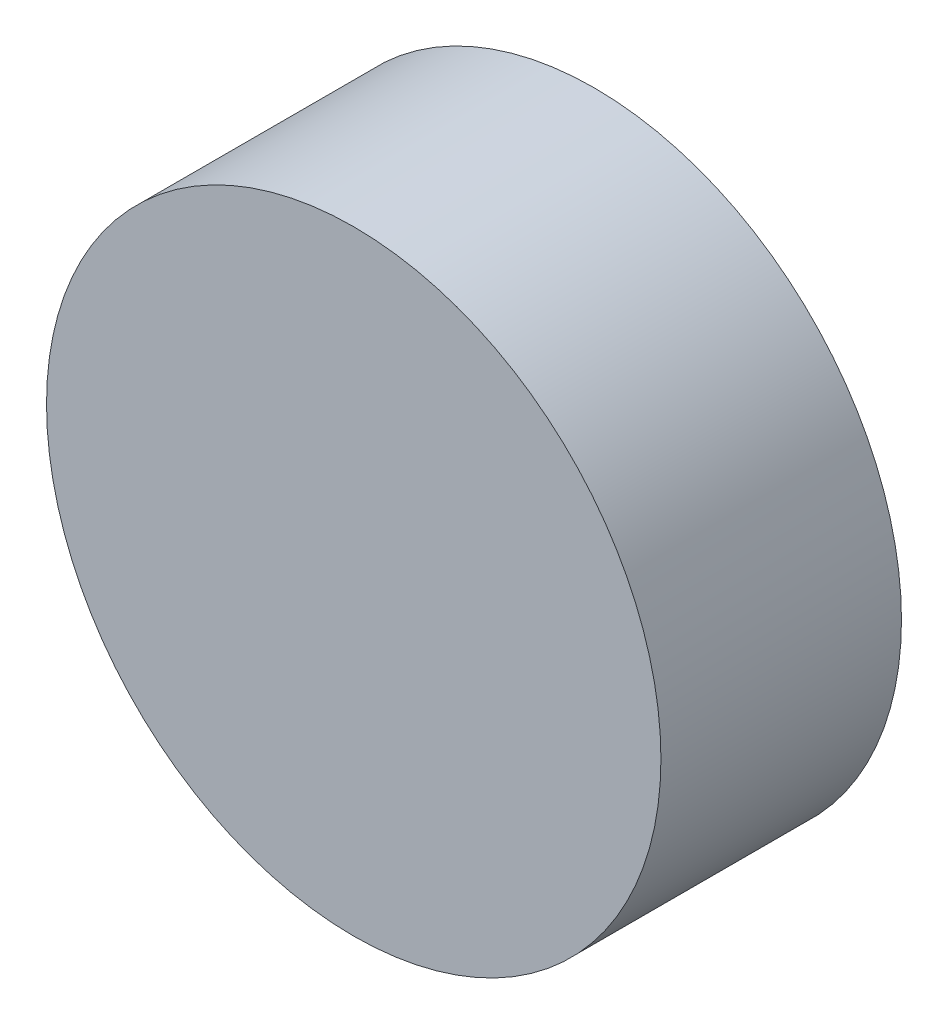
ISO-10303-21;
HEADER;
FILE_DESCRIPTION(('STEP AP214'),'2;1');
FILE_NAME('part.step','',(''),(''),'','','');
FILE_SCHEMA(('AUTOMOTIVE_DESIGN { 1 0 10303 214 1 1 1 1 }'));
ENDSEC;
DATA;
#1=APPLICATION_CONTEXT('core data for automotive mechanical design processes');
#2=APPLICATION_PROTOCOL_DEFINITION('international standard','automotive_design',2000,#1);
#3=PRODUCT_CONTEXT('',#1,'mechanical');
#4=PRODUCT('Part','Part','',(#3));
#5=PRODUCT_RELATED_PRODUCT_CATEGORY('part','',(#4));
#6=PRODUCT_DEFINITION_FORMATION('','',#4);
#7=PRODUCT_DEFINITION_CONTEXT('part definition',#1,'design');
#8=PRODUCT_DEFINITION('design','',#6,#7);
#9=PRODUCT_DEFINITION_SHAPE('','',#8);
#10=(LENGTH_UNIT() NAMED_UNIT(*) SI_UNIT(.MILLI.,.METRE.));
#11=(NAMED_UNIT(*) PLANE_ANGLE_UNIT() SI_UNIT($,.RADIAN.));
#12=(NAMED_UNIT(*) SI_UNIT($,.STERADIAN.) SOLID_ANGLE_UNIT());
#13=UNCERTAINTY_MEASURE_WITH_UNIT(LENGTH_MEASURE(1.E-05),#10,'distance_accuracy_value','');
#14=(GEOMETRIC_REPRESENTATION_CONTEXT(3) GLOBAL_UNCERTAINTY_ASSIGNED_CONTEXT((#13)) GLOBAL_UNIT_ASSIGNED_CONTEXT((#10,
#11,#12)) REPRESENTATION_CONTEXT('',''));
#15=CARTESIAN_POINT('',(0.,0.,0.));
#16=DIRECTION('',(0.,0.,1.));
#17=DIRECTION('',(1.,0.,0.));
#18=AXIS2_PLACEMENT_3D('',#15,#16,#17);
#19=CARTESIAN_POINT('',(0.,0.,41.5));
#20=DIRECTION('',(0.,0.,-1.));
#21=DIRECTION('',(-1.,0.,0.));
#22=AXIS2_PLACEMENT_3D('',#19,#20,#21);
#23=CYLINDRICAL_SURFACE('',#22,53.);
#24=CARTESIAN_POINT('',(0.,0.,41.5));
#25=DIRECTION('',(0.,0.,1.));
#26=DIRECTION('',(1.,0.,0.));
#27=AXIS2_PLACEMENT_3D('',#24,#25,#26);
#28=CIRCLE('',#27,53.);
#29=CARTESIAN_POINT('',(53.,0.,41.5));
#30=VERTEX_POINT('',#29);
#31=EDGE_CURVE('E10',#30,#30,#28,.T.);
#32=ORIENTED_EDGE('',*,*,#31,.F.);
#33=EDGE_LOOP('',(#32));
#34=FACE_BOUND('',#33,.T.);
#35=CARTESIAN_POINT('',(0.,0.,0.));
#36=DIRECTION('',(0.,0.,1.));
#37=DIRECTION('',(1.,0.,0.));
#38=AXIS2_PLACEMENT_3D('',#35,#36,#37);
#39=CIRCLE('',#38,53.);
#40=CARTESIAN_POINT('',(53.,0.,0.));
#41=VERTEX_POINT('',#40);
#42=EDGE_CURVE('E40',#41,#41,#39,.T.);
#43=ORIENTED_EDGE('',*,*,#42,.T.);
#44=EDGE_LOOP('',(#43));
#45=FACE_BOUND('',#44,.T.);
#46=ADVANCED_FACE('F37',(#34,#45),#23,.T.);
#47=CARTESIAN_POINT('',(0.,0.,41.5));
#48=DIRECTION('',(0.,0.,1.));
#49=DIRECTION('',(1.,0.,0.));
#50=AXIS2_PLACEMENT_3D('',#47,#48,#49);
#51=PLANE('',#50);
#52=ORIENTED_EDGE('',*,*,#31,.T.);
#53=EDGE_LOOP('',(#52));
#54=FACE_BOUND('',#53,.T.);
#55=ADVANCED_FACE('F52',(#54),#51,.T.);
#56=CARTESIAN_POINT('',(0.,0.,0.));
#57=DIRECTION('',(0.,0.,1.));
#58=DIRECTION('',(1.,0.,0.));
#59=AXIS2_PLACEMENT_3D('',#56,#57,#58);
#60=PLANE('',#59);
#61=ORIENTED_EDGE('',*,*,#42,.F.);
#62=EDGE_LOOP('',(#61));
#63=FACE_BOUND('',#62,.T.);
#64=ADVANCED_FACE('F50',(#63),#60,.F.);
#65=CLOSED_SHELL('',(#46,#55,#64));
#66=MANIFOLD_SOLID_BREP('B2',#65);
#67=ADVANCED_BREP_SHAPE_REPRESENTATION('',(#18,#66),#14);
#68=SHAPE_DEFINITION_REPRESENTATION(#9,#67);
ENDSEC;
END-ISO-10303-21;
